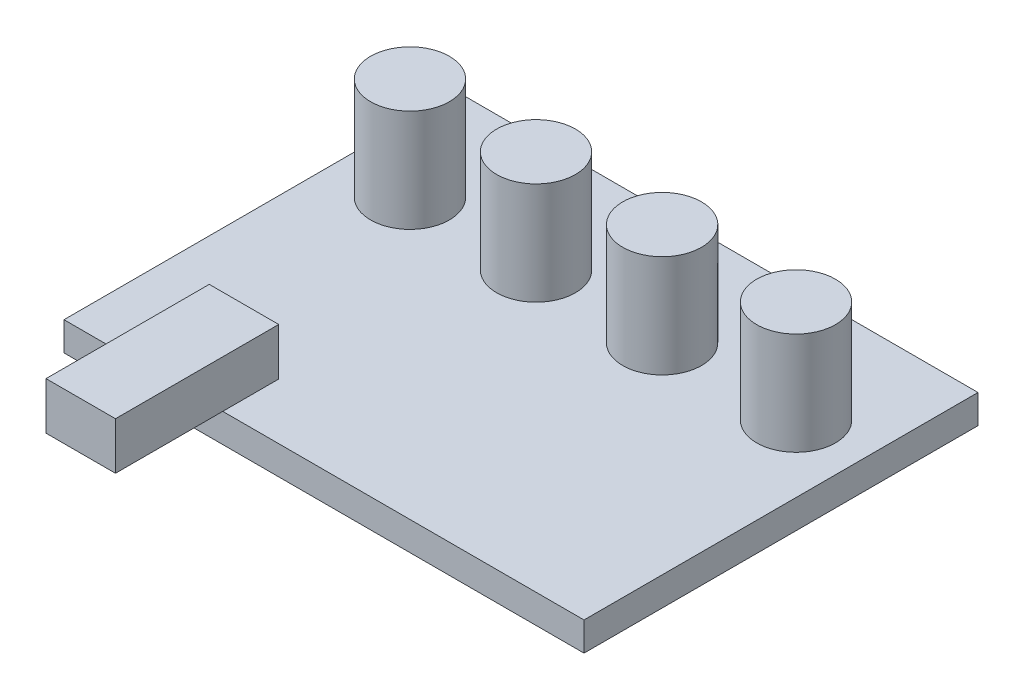
ISO-10303-21;
HEADER;
FILE_DESCRIPTION(('STEP AP214'),'2;1');
FILE_NAME('part.step','',(''),(''),'','','');
FILE_SCHEMA(('AUTOMOTIVE_DESIGN { 1 0 10303 214 1 1 1 1 }'));
ENDSEC;
DATA;
#1=APPLICATION_CONTEXT('core data for automotive mechanical design processes');
#2=APPLICATION_PROTOCOL_DEFINITION('international standard','automotive_design',2000,#1);
#3=PRODUCT_CONTEXT('',#1,'mechanical');
#4=PRODUCT('Part','Part','',(#3));
#5=PRODUCT_RELATED_PRODUCT_CATEGORY('part','',(#4));
#6=PRODUCT_DEFINITION_FORMATION('','',#4);
#7=PRODUCT_DEFINITION_CONTEXT('part definition',#1,'design');
#8=PRODUCT_DEFINITION('design','',#6,#7);
#9=PRODUCT_DEFINITION_SHAPE('','',#8);
#10=(LENGTH_UNIT() NAMED_UNIT(*) SI_UNIT(.MILLI.,.METRE.));
#11=(NAMED_UNIT(*) PLANE_ANGLE_UNIT() SI_UNIT($,.RADIAN.));
#12=(NAMED_UNIT(*) SI_UNIT($,.STERADIAN.) SOLID_ANGLE_UNIT());
#13=UNCERTAINTY_MEASURE_WITH_UNIT(LENGTH_MEASURE(1.E-05),#10,'distance_accuracy_value','');
#14=(GEOMETRIC_REPRESENTATION_CONTEXT(3) GLOBAL_UNCERTAINTY_ASSIGNED_CONTEXT((#13)) GLOBAL_UNIT_ASSIGNED_CONTEXT((#10,
#11,#12)) REPRESENTATION_CONTEXT('',''));
#15=CARTESIAN_POINT('',(0.,0.,0.));
#16=DIRECTION('',(0.,0.,1.));
#17=DIRECTION('',(1.,0.,0.));
#18=AXIS2_PLACEMENT_3D('',#15,#16,#17);
#19=CARTESIAN_POINT('',(0.,3.65,0.));
#20=DIRECTION('',(0.,-1.,0.));
#21=DIRECTION('',(0.,0.,-1.));
#22=AXIS2_PLACEMENT_3D('',#19,#20,#21);
#23=PLANE('',#22);
#24=CARTESIAN_POINT('',(-24.5,3.65,-9.71157326409538));
#25=DIRECTION('',(0.,-1.,0.));
#26=DIRECTION('',(0.,0.,-1.));
#27=AXIS2_PLACEMENT_3D('',#24,#25,#26);
#28=CIRCLE('',#27,5.);
#29=CARTESIAN_POINT('',(-24.5,3.65,-14.7115732640954));
#30=VERTEX_POINT('',#29);
#31=EDGE_CURVE('E193',#30,#30,#28,.F.);
#32=ORIENTED_EDGE('',*,*,#31,.F.);
#33=EDGE_LOOP('',(#32));
#34=FACE_BOUND('',#33,.T.);
#35=CARTESIAN_POINT('',(-8.5,3.65,-9.71157326409538));
#36=DIRECTION('',(0.,-1.,0.));
#37=DIRECTION('',(0.,0.,-1.));
#38=AXIS2_PLACEMENT_3D('',#35,#36,#37);
#39=CIRCLE('',#38,5.);
#40=CARTESIAN_POINT('',(-8.5,3.65,-14.7115732640954));
#41=VERTEX_POINT('',#40);
#42=EDGE_CURVE('E196',#41,#41,#39,.F.);
#43=ORIENTED_EDGE('',*,*,#42,.F.);
#44=EDGE_LOOP('',(#43));
#45=FACE_BOUND('',#44,.T.);
#46=CARTESIAN_POINT('',(7.5,3.65,-9.71157326409538));
#47=DIRECTION('',(0.,-1.,0.));
#48=DIRECTION('',(0.,0.,-1.));
#49=AXIS2_PLACEMENT_3D('',#46,#47,#48);
#50=CIRCLE('',#49,5.);
#51=CARTESIAN_POINT('',(7.5,3.65,-14.7115732640954));
#52=VERTEX_POINT('',#51);
#53=EDGE_CURVE('E199',#52,#52,#50,.F.);
#54=ORIENTED_EDGE('',*,*,#53,.F.);
#55=EDGE_LOOP('',(#54));
#56=FACE_BOUND('',#55,.T.);
#57=CARTESIAN_POINT('',(24.5,3.65,-9.71157326409538));
#58=DIRECTION('',(0.,-1.,0.));
#59=DIRECTION('',(0.,0.,-1.));
#60=AXIS2_PLACEMENT_3D('',#57,#58,#59);
#61=CIRCLE('',#60,5.);
#62=CARTESIAN_POINT('',(24.5,3.65,-14.7115732640954));
#63=VERTEX_POINT('',#62);
#64=EDGE_CURVE('E53',#63,#63,#61,.F.);
#65=ORIENTED_EDGE('',*,*,#64,.F.);
#66=EDGE_LOOP('',(#65));
#67=FACE_BOUND('',#66,.T.);
#68=DIRECTION('',(0.,0.,1.));
#69=VECTOR('',#68,1.);
#70=CARTESIAN_POINT('',(-21.6659753884867,3.65,18.5965502759947));
#71=LINE('',#70,#69);
#72=CARTESIAN_POINT('',(-21.6659753884867,3.65,18.5965502759947));
#73=VERTEX_POINT('',#72);
#74=CARTESIAN_POINT('',(-21.6659753884867,3.65,25.7));
#75=VERTEX_POINT('',#74);
#76=EDGE_CURVE('E210',#73,#75,#71,.T.);
#77=ORIENTED_EDGE('',*,*,#76,.F.);
#78=DIRECTION('',(-1.,0.,0.));
#79=VECTOR('',#78,1.);
#80=CARTESIAN_POINT('',(-21.6659753884867,3.65,18.5965502759947));
#81=LINE('',#80,#79);
#82=CARTESIAN_POINT('',(-12.8496683926261,3.65,18.5965502759947));
#83=VERTEX_POINT('',#82);
#84=EDGE_CURVE('E60',#83,#73,#81,.T.);
#85=ORIENTED_EDGE('',*,*,#84,.F.);
#86=DIRECTION('',(0.,0.,-1.));
#87=VECTOR('',#86,1.);
#88=CARTESIAN_POINT('',(-12.8496683926261,3.65,0.));
#89=LINE('',#88,#87);
#90=CARTESIAN_POINT('',(-12.8496683926261,3.65,25.7));
#91=VERTEX_POINT('',#90);
#92=EDGE_CURVE('E11',#91,#83,#89,.T.);
#93=ORIENTED_EDGE('',*,*,#92,.F.);
#94=DIRECTION('',(1.,0.,0.));
#95=VECTOR('',#94,1.);
#96=CARTESIAN_POINT('',(32.9989133056295,3.65,25.7));
#97=LINE('',#96,#95);
#98=CARTESIAN_POINT('',(32.9989133056295,3.65,25.7));
#99=VERTEX_POINT('',#98);
#100=EDGE_CURVE('E161',#91,#99,#97,.T.);
#101=ORIENTED_EDGE('',*,*,#100,.T.);
#102=DIRECTION('',(0.,0.,-1.));
#103=VECTOR('',#102,1.);
#104=CARTESIAN_POINT('',(32.9989133056295,3.65,-24.3));
#105=LINE('',#104,#103);
#106=CARTESIAN_POINT('',(32.9989133056295,3.65,-24.3));
#107=VERTEX_POINT('',#106);
#108=EDGE_CURVE('E167',#99,#107,#105,.T.);
#109=ORIENTED_EDGE('',*,*,#108,.T.);
#110=DIRECTION('',(-1.,0.,0.));
#111=VECTOR('',#110,1.);
#112=CARTESIAN_POINT('',(-32.9989133056295,3.65,-24.3));
#113=LINE('',#112,#111);
#114=CARTESIAN_POINT('',(-32.9989133056295,3.65,-24.3));
#115=VERTEX_POINT('',#114);
#116=EDGE_CURVE('E171',#107,#115,#113,.T.);
#117=ORIENTED_EDGE('',*,*,#116,.T.);
#118=DIRECTION('',(0.,0.,1.));
#119=VECTOR('',#118,1.);
#120=CARTESIAN_POINT('',(-32.9989133056295,3.65,-24.3));
#121=LINE('',#120,#119);
#122=CARTESIAN_POINT('',(-32.9989133056295,3.65,25.7));
#123=VERTEX_POINT('',#122);
#124=EDGE_CURVE('E157',#115,#123,#121,.T.);
#125=ORIENTED_EDGE('',*,*,#124,.T.);
#126=EDGE_CURVE('E163',#123,#75,#97,.T.);
#127=ORIENTED_EDGE('',*,*,#126,.T.);
#128=EDGE_LOOP('',(#77,#85,#93,#101,#109,#117,#125,#127));
#129=FACE_BOUND('',#128,.T.);
#130=ADVANCED_FACE('F45',(#34,#45,#56,#67,#129),#23,.F.);
#131=CARTESIAN_POINT('',(-32.9989133056295,3.65,-24.3));
#132=DIRECTION('',(1.,0.,0.));
#133=DIRECTION('',(0.,0.,-1.));
#134=AXIS2_PLACEMENT_3D('',#131,#132,#133);
#135=PLANE('',#134);
#136=DIRECTION('',(0.,0.,1.));
#137=VECTOR('',#136,1.);
#138=CARTESIAN_POINT('',(-32.9989133056295,0.,-24.3));
#139=LINE('',#138,#137);
#140=CARTESIAN_POINT('',(-32.9989133056295,0.,-24.3));
#141=VERTEX_POINT('',#140);
#142=CARTESIAN_POINT('',(-32.9989133056295,0.,25.7));
#143=VERTEX_POINT('',#142);
#144=EDGE_CURVE('E156',#141,#143,#139,.T.);
#145=ORIENTED_EDGE('',*,*,#144,.T.);
#146=DIRECTION('',(0.,-1.,0.));
#147=VECTOR('',#146,1.);
#148=CARTESIAN_POINT('',(-32.9989133056295,3.65,25.7));
#149=LINE('',#148,#147);
#150=EDGE_CURVE('E190',#123,#143,#149,.T.);
#151=ORIENTED_EDGE('',*,*,#150,.F.);
#152=ORIENTED_EDGE('',*,*,#124,.F.);
#153=DIRECTION('',(0.,-1.,0.));
#154=VECTOR('',#153,1.);
#155=CARTESIAN_POINT('',(-32.9989133056295,3.65,-24.3));
#156=LINE('',#155,#154);
#157=EDGE_CURVE('E173',#115,#141,#156,.T.);
#158=ORIENTED_EDGE('',*,*,#157,.T.);
#159=EDGE_LOOP('',(#145,#151,#152,#158));
#160=FACE_BOUND('',#159,.T.);
#161=ADVANCED_FACE('F47',(#160),#135,.F.);
#162=CARTESIAN_POINT('',(32.9989133056295,3.65,25.7));
#163=DIRECTION('',(0.,0.,-1.));
#164=DIRECTION('',(-1.,0.,0.));
#165=AXIS2_PLACEMENT_3D('',#162,#163,#164);
#166=PLANE('',#165);
#167=DIRECTION('',(1.,0.,0.));
#168=VECTOR('',#167,1.);
#169=CARTESIAN_POINT('',(32.9989133056295,0.,25.7));
#170=LINE('',#169,#168);
#171=CARTESIAN_POINT('',(32.9989133056295,0.,25.7));
#172=VERTEX_POINT('',#171);
#173=EDGE_CURVE('E176',#143,#172,#170,.T.);
#174=ORIENTED_EDGE('',*,*,#173,.T.);
#175=DIRECTION('',(0.,-1.,0.));
#176=VECTOR('',#175,1.);
#177=CARTESIAN_POINT('',(32.9989133056295,3.65,25.7));
#178=LINE('',#177,#176);
#179=EDGE_CURVE('E187',#99,#172,#178,.T.);
#180=ORIENTED_EDGE('',*,*,#179,.F.);
#181=ORIENTED_EDGE('',*,*,#100,.F.);
#182=EDGE_CURVE('E168',#75,#91,#97,.T.);
#183=ORIENTED_EDGE('',*,*,#182,.F.);
#184=ORIENTED_EDGE('',*,*,#126,.F.);
#185=ORIENTED_EDGE('',*,*,#150,.T.);
#186=EDGE_LOOP('',(#174,#180,#181,#183,#184,#185));
#187=FACE_BOUND('',#186,.T.);
#188=ADVANCED_FACE('F236',(#187),#166,.F.);
#189=CARTESIAN_POINT('',(32.9989133056295,3.65,-24.3));
#190=DIRECTION('',(-1.,0.,0.));
#191=DIRECTION('',(0.,0.,1.));
#192=AXIS2_PLACEMENT_3D('',#189,#190,#191);
#193=PLANE('',#192);
#194=DIRECTION('',(0.,0.,-1.));
#195=VECTOR('',#194,1.);
#196=CARTESIAN_POINT('',(32.9989133056295,0.,-24.3));
#197=LINE('',#196,#195);
#198=CARTESIAN_POINT('',(32.9989133056295,0.,-24.3));
#199=VERTEX_POINT('',#198);
#200=EDGE_CURVE('E178',#172,#199,#197,.T.);
#201=ORIENTED_EDGE('',*,*,#200,.T.);
#202=DIRECTION('',(0.,-1.,0.));
#203=VECTOR('',#202,1.);
#204=CARTESIAN_POINT('',(32.9989133056295,3.65,-24.3));
#205=LINE('',#204,#203);
#206=EDGE_CURVE('E184',#107,#199,#205,.T.);
#207=ORIENTED_EDGE('',*,*,#206,.F.);
#208=ORIENTED_EDGE('',*,*,#108,.F.);
#209=ORIENTED_EDGE('',*,*,#179,.T.);
#210=EDGE_LOOP('',(#201,#207,#208,#209));
#211=FACE_BOUND('',#210,.T.);
#212=ADVANCED_FACE('F239',(#211),#193,.F.);
#213=CARTESIAN_POINT('',(-32.9989133056295,3.65,-24.3));
#214=DIRECTION('',(0.,0.,1.));
#215=DIRECTION('',(1.,0.,0.));
#216=AXIS2_PLACEMENT_3D('',#213,#214,#215);
#217=PLANE('',#216);
#218=DIRECTION('',(-1.,0.,0.));
#219=VECTOR('',#218,1.);
#220=CARTESIAN_POINT('',(-32.9989133056295,0.,-24.3));
#221=LINE('',#220,#219);
#222=EDGE_CURVE('E162',#199,#141,#221,.T.);
#223=ORIENTED_EDGE('',*,*,#222,.T.);
#224=ORIENTED_EDGE('',*,*,#157,.F.);
#225=ORIENTED_EDGE('',*,*,#116,.F.);
#226=ORIENTED_EDGE('',*,*,#206,.T.);
#227=EDGE_LOOP('',(#223,#224,#225,#226));
#228=FACE_BOUND('',#227,.T.);
#229=ADVANCED_FACE('F244',(#228),#217,.F.);
#230=CARTESIAN_POINT('',(0.,0.,0.));
#231=DIRECTION('',(0.,-1.,0.));
#232=DIRECTION('',(0.,0.,-1.));
#233=AXIS2_PLACEMENT_3D('',#230,#231,#232);
#234=PLANE('',#233);
#235=ORIENTED_EDGE('',*,*,#144,.F.);
#236=ORIENTED_EDGE('',*,*,#222,.F.);
#237=ORIENTED_EDGE('',*,*,#200,.F.);
#238=ORIENTED_EDGE('',*,*,#173,.F.);
#239=EDGE_LOOP('',(#235,#236,#237,#238));
#240=FACE_BOUND('',#239,.T.);
#241=ADVANCED_FACE('F250',(#240),#234,.T.);
#242=CARTESIAN_POINT('',(-24.5,16.65,-9.71157326409538));
#243=DIRECTION('',(0.,-1.,0.));
#244=DIRECTION('',(0.,0.,-1.));
#245=AXIS2_PLACEMENT_3D('',#242,#243,#244);
#246=CYLINDRICAL_SURFACE('',#245,5.);
#247=CARTESIAN_POINT('',(-24.5,16.65,-9.71157326409538));
#248=DIRECTION('',(0.,1.,0.));
#249=DIRECTION('',(0.,0.,1.));
#250=AXIS2_PLACEMENT_3D('',#247,#248,#249);
#251=CIRCLE('',#250,5.);
#252=CARTESIAN_POINT('',(-24.5,16.65,-14.7115732640954));
#253=VERTEX_POINT('',#252);
#254=EDGE_CURVE('E153',#253,#253,#251,.T.);
#255=CARTESIAN_POINT('',(-24.5,16.65,-14.7115732640954));
#256=CARTESIAN_POINT('',(-24.5,16.5145833333333,-14.7115732640954));
#257=CARTESIAN_POINT('',(-24.5,16.3791666666667,-14.7115732640954));
#258=CARTESIAN_POINT('',(-24.5,16.1083333333333,-14.7115732640954));
#259=CARTESIAN_POINT('',(-24.5,15.9729166666667,-14.7115732640954));
#260=CARTESIAN_POINT('',(-24.5,15.7020833333333,-14.7115732640954));
#261=CARTESIAN_POINT('',(-24.5,15.5666666666667,-14.7115732640954));
#262=CARTESIAN_POINT('',(-24.5,15.2958333333333,-14.7115732640954));
#263=CARTESIAN_POINT('',(-24.5,15.1604166666667,-14.7115732640954));
#264=CARTESIAN_POINT('',(-24.5,14.8895833333333,-14.7115732640954));
#265=CARTESIAN_POINT('',(-24.5,14.7541666666667,-14.7115732640954));
#266=CARTESIAN_POINT('',(-24.5,14.4833333333333,-14.7115732640954));
#267=CARTESIAN_POINT('',(-24.5,14.3479166666667,-14.7115732640954));
#268=CARTESIAN_POINT('',(-24.5,14.0770833333333,-14.7115732640954));
#269=CARTESIAN_POINT('',(-24.5,13.9416666666667,-14.7115732640954));
#270=CARTESIAN_POINT('',(-24.5,13.6708333333333,-14.7115732640954));
#271=CARTESIAN_POINT('',(-24.5,13.5354166666667,-14.7115732640954));
#272=CARTESIAN_POINT('',(-24.5,13.2645833333333,-14.7115732640954));
#273=CARTESIAN_POINT('',(-24.5,13.1291666666667,-14.7115732640954));
#274=CARTESIAN_POINT('',(-24.5,12.8583333333333,-14.7115732640954));
#275=CARTESIAN_POINT('',(-24.5,12.7229166666667,-14.7115732640954));
#276=CARTESIAN_POINT('',(-24.5,12.4520833333333,-14.7115732640954));
#277=CARTESIAN_POINT('',(-24.5,12.3166666666667,-14.7115732640954));
#278=CARTESIAN_POINT('',(-24.5,12.0458333333333,-14.7115732640954));
#279=CARTESIAN_POINT('',(-24.5,11.9104166666667,-14.7115732640954));
#280=CARTESIAN_POINT('',(-24.5,11.6395833333333,-14.7115732640954));
#281=CARTESIAN_POINT('',(-24.5,11.5041666666667,-14.7115732640954));
#282=CARTESIAN_POINT('',(-24.5,11.2333333333333,-14.7115732640954));
#283=CARTESIAN_POINT('',(-24.5,11.0979166666667,-14.7115732640954));
#284=CARTESIAN_POINT('',(-24.5,10.8270833333333,-14.7115732640954));
#285=CARTESIAN_POINT('',(-24.5,10.6916666666667,-14.7115732640954));
#286=CARTESIAN_POINT('',(-24.5,10.4208333333333,-14.7115732640954));
#287=CARTESIAN_POINT('',(-24.5,10.2854166666667,-14.7115732640954));
#288=CARTESIAN_POINT('',(-24.5,10.0145833333333,-14.7115732640954));
#289=CARTESIAN_POINT('',(-24.5,9.87916666666667,-14.7115732640954));
#290=CARTESIAN_POINT('',(-24.5,9.60833333333333,-14.7115732640954));
#291=CARTESIAN_POINT('',(-24.5,9.47291666666667,-14.7115732640954));
#292=CARTESIAN_POINT('',(-24.5,9.20208333333333,-14.7115732640954));
#293=CARTESIAN_POINT('',(-24.5,9.06666666666667,-14.7115732640954));
#294=CARTESIAN_POINT('',(-24.5,8.79583333333333,-14.7115732640954));
#295=CARTESIAN_POINT('',(-24.5,8.66041666666667,-14.7115732640954));
#296=CARTESIAN_POINT('',(-24.5,8.38958333333333,-14.7115732640954));
#297=CARTESIAN_POINT('',(-24.5,8.25416666666667,-14.7115732640954));
#298=CARTESIAN_POINT('',(-24.5,7.98333333333333,-14.7115732640954));
#299=CARTESIAN_POINT('',(-24.5,7.84791666666667,-14.7115732640954));
#300=CARTESIAN_POINT('',(-24.5,7.57708333333333,-14.7115732640954));
#301=CARTESIAN_POINT('',(-24.5,7.44166666666667,-14.7115732640954));
#302=CARTESIAN_POINT('',(-24.5,7.17083333333333,-14.7115732640954));
#303=CARTESIAN_POINT('',(-24.5,7.03541666666667,-14.7115732640954));
#304=CARTESIAN_POINT('',(-24.5,6.76458333333334,-14.7115732640954));
#305=CARTESIAN_POINT('',(-24.5,6.62916666666667,-14.7115732640954));
#306=CARTESIAN_POINT('',(-24.5,6.35833333333334,-14.7115732640954));
#307=CARTESIAN_POINT('',(-24.5,6.22291666666667,-14.7115732640954));
#308=CARTESIAN_POINT('',(-24.5,5.95208333333333,-14.7115732640954));
#309=CARTESIAN_POINT('',(-24.5,5.81666666666667,-14.7115732640954));
#310=CARTESIAN_POINT('',(-24.5,5.54583333333334,-14.7115732640954));
#311=CARTESIAN_POINT('',(-24.5,5.41041666666667,-14.7115732640954));
#312=CARTESIAN_POINT('',(-24.5,5.13958333333334,-14.7115732640954));
#313=CARTESIAN_POINT('',(-24.5,5.00416666666667,-14.7115732640954));
#314=CARTESIAN_POINT('',(-24.5,4.73333333333334,-14.7115732640954));
#315=CARTESIAN_POINT('',(-24.5,4.59791666666667,-14.7115732640954));
#316=CARTESIAN_POINT('',(-24.5,4.32708333333333,-14.7115732640954));
#317=CARTESIAN_POINT('',(-24.5,4.19166666666667,-14.7115732640954));
#318=CARTESIAN_POINT('',(-24.5,3.92083333333334,-14.7115732640954));
#319=CARTESIAN_POINT('',(-24.5,3.78541666666667,-14.7115732640954));
#320=CARTESIAN_POINT('',(-24.5,3.65,-14.7115732640954));
#321=B_SPLINE_CURVE_WITH_KNOTS('',3,(#255,#256,#257,#258,#259,#260,#261,#262,#263,#264,#265,
#266,#267,#268,#269,#270,#271,#272,#273,#274,#275,#276,#277,#278,#279,#280,#281,#282,#283,#284,
#285,#286,#287,#288,#289,#290,#291,#292,#293,#294,#295,#296,#297,#298,#299,#300,#301,#302,#303,
#304,#305,#306,#307,#308,#309,#310,#311,#312,#313,#314,#315,#316,#317,#318,#319,#320),
.UNSPECIFIED.,.F.,.F.,(4,2,2,2,2,2,2,2,2,2,2,2,2,2,2,2,2,2,2,2,2,2,2,2,2,2,2,2,2,2,2,2,4),(0.,
0.40625,0.812500000000001,1.21875,1.625,2.03125,2.4375,2.84375,3.25,3.65625,4.0625,4.46875,
4.875,5.28125,5.6875,6.09375,6.5,6.90625,7.3125,7.71875,8.125,8.53125,8.9375,9.34375,9.75,
10.15625,10.5625,10.96875,11.375,11.78125,12.1875,12.59375,13.),.UNSPECIFIED.);
#322=EDGE_CURVE('BSEAM252',#253,#30,#321,.T.);
#323=ORIENTED_EDGE('',*,*,#254,.F.);
#324=ORIENTED_EDGE('',*,*,#31,.T.);
#325=ORIENTED_EDGE('',*,*,#322,.T.);
#326=ORIENTED_EDGE('',*,*,#322,.F.);
#327=EDGE_LOOP('',(#323,#325,#324,#326));
#328=FACE_BOUND('',#327,.T.);
#329=ADVANCED_FACE('F252',(#328),#246,.T.);
#330=CARTESIAN_POINT('',(-24.5,16.65,-9.71157326409538));
#331=DIRECTION('',(0.,1.,0.));
#332=DIRECTION('',(0.,0.,1.));
#333=AXIS2_PLACEMENT_3D('',#330,#331,#332);
#334=PLANE('',#333);
#335=ORIENTED_EDGE('',*,*,#254,.T.);
#336=EDGE_LOOP('',(#335));
#337=FACE_BOUND('',#336,.T.);
#338=ADVANCED_FACE('F257',(#337),#334,.T.);
#339=CARTESIAN_POINT('',(-8.5,16.65,-9.71157326409538));
#340=DIRECTION('',(0.,-1.,0.));
#341=DIRECTION('',(0.,0.,-1.));
#342=AXIS2_PLACEMENT_3D('',#339,#340,#341);
#343=CYLINDRICAL_SURFACE('',#342,5.);
#344=CARTESIAN_POINT('',(-8.5,16.65,-9.71157326409538));
#345=DIRECTION('',(0.,1.,0.));
#346=DIRECTION('',(0.,0.,1.));
#347=AXIS2_PLACEMENT_3D('',#344,#345,#346);
#348=CIRCLE('',#347,5.);
#349=CARTESIAN_POINT('',(-8.5,16.65,-14.7115732640954));
#350=VERTEX_POINT('',#349);
#351=EDGE_CURVE('E150',#350,#350,#348,.T.);
#352=CARTESIAN_POINT('',(-8.5,16.65,-14.7115732640954));
#353=CARTESIAN_POINT('',(-8.5,16.5145833333333,-14.7115732640954));
#354=CARTESIAN_POINT('',(-8.5,16.3791666666667,-14.7115732640954));
#355=CARTESIAN_POINT('',(-8.5,16.1083333333333,-14.7115732640954));
#356=CARTESIAN_POINT('',(-8.5,15.9729166666667,-14.7115732640954));
#357=CARTESIAN_POINT('',(-8.5,15.7020833333333,-14.7115732640954));
#358=CARTESIAN_POINT('',(-8.5,15.5666666666667,-14.7115732640954));
#359=CARTESIAN_POINT('',(-8.5,15.2958333333333,-14.7115732640954));
#360=CARTESIAN_POINT('',(-8.5,15.1604166666667,-14.7115732640954));
#361=CARTESIAN_POINT('',(-8.5,14.8895833333333,-14.7115732640954));
#362=CARTESIAN_POINT('',(-8.5,14.7541666666667,-14.7115732640954));
#363=CARTESIAN_POINT('',(-8.5,14.4833333333333,-14.7115732640954));
#364=CARTESIAN_POINT('',(-8.5,14.3479166666667,-14.7115732640954));
#365=CARTESIAN_POINT('',(-8.5,14.0770833333333,-14.7115732640954));
#366=CARTESIAN_POINT('',(-8.5,13.9416666666667,-14.7115732640954));
#367=CARTESIAN_POINT('',(-8.5,13.6708333333333,-14.7115732640954));
#368=CARTESIAN_POINT('',(-8.5,13.5354166666667,-14.7115732640954));
#369=CARTESIAN_POINT('',(-8.5,13.2645833333333,-14.7115732640954));
#370=CARTESIAN_POINT('',(-8.5,13.1291666666667,-14.7115732640954));
#371=CARTESIAN_POINT('',(-8.5,12.8583333333333,-14.7115732640954));
#372=CARTESIAN_POINT('',(-8.5,12.7229166666667,-14.7115732640954));
#373=CARTESIAN_POINT('',(-8.5,12.4520833333333,-14.7115732640954));
#374=CARTESIAN_POINT('',(-8.5,12.3166666666667,-14.7115732640954));
#375=CARTESIAN_POINT('',(-8.5,12.0458333333333,-14.7115732640954));
#376=CARTESIAN_POINT('',(-8.5,11.9104166666667,-14.7115732640954));
#377=CARTESIAN_POINT('',(-8.5,11.6395833333333,-14.7115732640954));
#378=CARTESIAN_POINT('',(-8.5,11.5041666666667,-14.7115732640954));
#379=CARTESIAN_POINT('',(-8.5,11.2333333333333,-14.7115732640954));
#380=CARTESIAN_POINT('',(-8.5,11.0979166666667,-14.7115732640954));
#381=CARTESIAN_POINT('',(-8.5,10.8270833333333,-14.7115732640954));
#382=CARTESIAN_POINT('',(-8.5,10.6916666666667,-14.7115732640954));
#383=CARTESIAN_POINT('',(-8.5,10.4208333333333,-14.7115732640954));
#384=CARTESIAN_POINT('',(-8.5,10.2854166666667,-14.7115732640954));
#385=CARTESIAN_POINT('',(-8.5,10.0145833333333,-14.7115732640954));
#386=CARTESIAN_POINT('',(-8.5,9.87916666666667,-14.7115732640954));
#387=CARTESIAN_POINT('',(-8.5,9.60833333333333,-14.7115732640954));
#388=CARTESIAN_POINT('',(-8.5,9.47291666666667,-14.7115732640954));
#389=CARTESIAN_POINT('',(-8.5,9.20208333333333,-14.7115732640954));
#390=CARTESIAN_POINT('',(-8.5,9.06666666666667,-14.7115732640954));
#391=CARTESIAN_POINT('',(-8.5,8.79583333333333,-14.7115732640954));
#392=CARTESIAN_POINT('',(-8.5,8.66041666666667,-14.7115732640954));
#393=CARTESIAN_POINT('',(-8.5,8.38958333333333,-14.7115732640954));
#394=CARTESIAN_POINT('',(-8.5,8.25416666666667,-14.7115732640954));
#395=CARTESIAN_POINT('',(-8.5,7.98333333333333,-14.7115732640954));
#396=CARTESIAN_POINT('',(-8.5,7.84791666666667,-14.7115732640954));
#397=CARTESIAN_POINT('',(-8.5,7.57708333333333,-14.7115732640954));
#398=CARTESIAN_POINT('',(-8.5,7.44166666666667,-14.7115732640954));
#399=CARTESIAN_POINT('',(-8.5,7.17083333333333,-14.7115732640954));
#400=CARTESIAN_POINT('',(-8.5,7.03541666666667,-14.7115732640954));
#401=CARTESIAN_POINT('',(-8.5,6.76458333333334,-14.7115732640954));
#402=CARTESIAN_POINT('',(-8.5,6.62916666666667,-14.7115732640954));
#403=CARTESIAN_POINT('',(-8.5,6.35833333333334,-14.7115732640954));
#404=CARTESIAN_POINT('',(-8.5,6.22291666666667,-14.7115732640954));
#405=CARTESIAN_POINT('',(-8.5,5.95208333333333,-14.7115732640954));
#406=CARTESIAN_POINT('',(-8.5,5.81666666666667,-14.7115732640954));
#407=CARTESIAN_POINT('',(-8.5,5.54583333333334,-14.7115732640954));
#408=CARTESIAN_POINT('',(-8.5,5.41041666666667,-14.7115732640954));
#409=CARTESIAN_POINT('',(-8.5,5.13958333333334,-14.7115732640954));
#410=CARTESIAN_POINT('',(-8.5,5.00416666666667,-14.7115732640954));
#411=CARTESIAN_POINT('',(-8.5,4.73333333333334,-14.7115732640954));
#412=CARTESIAN_POINT('',(-8.5,4.59791666666667,-14.7115732640954));
#413=CARTESIAN_POINT('',(-8.5,4.32708333333333,-14.7115732640954));
#414=CARTESIAN_POINT('',(-8.5,4.19166666666667,-14.7115732640954));
#415=CARTESIAN_POINT('',(-8.5,3.92083333333334,-14.7115732640954));
#416=CARTESIAN_POINT('',(-8.5,3.78541666666667,-14.7115732640954));
#417=CARTESIAN_POINT('',(-8.5,3.65,-14.7115732640954));
#418=B_SPLINE_CURVE_WITH_KNOTS('',3,(#352,#353,#354,#355,#356,#357,#358,#359,#360,#361,#362,
#363,#364,#365,#366,#367,#368,#369,#370,#371,#372,#373,#374,#375,#376,#377,#378,#379,#380,#381,
#382,#383,#384,#385,#386,#387,#388,#389,#390,#391,#392,#393,#394,#395,#396,#397,#398,#399,#400,
#401,#402,#403,#404,#405,#406,#407,#408,#409,#410,#411,#412,#413,#414,#415,#416,#417),
.UNSPECIFIED.,.F.,.F.,(4,2,2,2,2,2,2,2,2,2,2,2,2,2,2,2,2,2,2,2,2,2,2,2,2,2,2,2,2,2,2,2,4),(0.,
0.40625,0.812500000000001,1.21875,1.625,2.03125,2.4375,2.84375,3.25,3.65625,4.0625,4.46875,
4.875,5.28125,5.6875,6.09375,6.5,6.90625,7.3125,7.71875,8.125,8.53125,8.9375,9.34375,9.75,
10.15625,10.5625,10.96875,11.375,11.78125,12.1875,12.59375,13.),.UNSPECIFIED.);
#419=EDGE_CURVE('BSEAM286',#350,#41,#418,.T.);
#420=ORIENTED_EDGE('',*,*,#351,.F.);
#421=ORIENTED_EDGE('',*,*,#42,.T.);
#422=ORIENTED_EDGE('',*,*,#419,.T.);
#423=ORIENTED_EDGE('',*,*,#419,.F.);
#424=EDGE_LOOP('',(#420,#422,#421,#423));
#425=FACE_BOUND('',#424,.T.);
#426=ADVANCED_FACE('F286',(#425),#343,.T.);
#427=CARTESIAN_POINT('',(-8.5,16.65,-9.71157326409538));
#428=DIRECTION('',(0.,1.,0.));
#429=DIRECTION('',(0.,0.,1.));
#430=AXIS2_PLACEMENT_3D('',#427,#428,#429);
#431=PLANE('',#430);
#432=ORIENTED_EDGE('',*,*,#351,.T.);
#433=EDGE_LOOP('',(#432));
#434=FACE_BOUND('',#433,.T.);
#435=ADVANCED_FACE('F279',(#434),#431,.T.);
#436=CARTESIAN_POINT('',(7.5,16.65,-9.71157326409538));
#437=DIRECTION('',(0.,-1.,0.));
#438=DIRECTION('',(0.,0.,-1.));
#439=AXIS2_PLACEMENT_3D('',#436,#437,#438);
#440=CYLINDRICAL_SURFACE('',#439,5.);
#441=CARTESIAN_POINT('',(7.5,16.65,-9.71157326409538));
#442=DIRECTION('',(0.,1.,0.));
#443=DIRECTION('',(0.,0.,1.));
#444=AXIS2_PLACEMENT_3D('',#441,#442,#443);
#445=CIRCLE('',#444,5.);
#446=CARTESIAN_POINT('',(7.5,16.65,-14.7115732640954));
#447=VERTEX_POINT('',#446);
#448=EDGE_CURVE('E141',#447,#447,#445,.T.);
#449=CARTESIAN_POINT('',(7.5,16.65,-14.7115732640954));
#450=CARTESIAN_POINT('',(7.5,16.5145833333333,-14.7115732640954));
#451=CARTESIAN_POINT('',(7.5,16.3791666666667,-14.7115732640954));
#452=CARTESIAN_POINT('',(7.5,16.1083333333333,-14.7115732640954));
#453=CARTESIAN_POINT('',(7.5,15.9729166666667,-14.7115732640954));
#454=CARTESIAN_POINT('',(7.5,15.7020833333333,-14.7115732640954));
#455=CARTESIAN_POINT('',(7.5,15.5666666666667,-14.7115732640954));
#456=CARTESIAN_POINT('',(7.5,15.2958333333333,-14.7115732640954));
#457=CARTESIAN_POINT('',(7.5,15.1604166666667,-14.7115732640954));
#458=CARTESIAN_POINT('',(7.5,14.8895833333333,-14.7115732640954));
#459=CARTESIAN_POINT('',(7.5,14.7541666666667,-14.7115732640954));
#460=CARTESIAN_POINT('',(7.5,14.4833333333333,-14.7115732640954));
#461=CARTESIAN_POINT('',(7.5,14.3479166666667,-14.7115732640954));
#462=CARTESIAN_POINT('',(7.5,14.0770833333333,-14.7115732640954));
#463=CARTESIAN_POINT('',(7.5,13.9416666666667,-14.7115732640954));
#464=CARTESIAN_POINT('',(7.5,13.6708333333333,-14.7115732640954));
#465=CARTESIAN_POINT('',(7.5,13.5354166666667,-14.7115732640954));
#466=CARTESIAN_POINT('',(7.5,13.2645833333333,-14.7115732640954));
#467=CARTESIAN_POINT('',(7.5,13.1291666666667,-14.7115732640954));
#468=CARTESIAN_POINT('',(7.5,12.8583333333333,-14.7115732640954));
#469=CARTESIAN_POINT('',(7.5,12.7229166666667,-14.7115732640954));
#470=CARTESIAN_POINT('',(7.5,12.4520833333333,-14.7115732640954));
#471=CARTESIAN_POINT('',(7.5,12.3166666666667,-14.7115732640954));
#472=CARTESIAN_POINT('',(7.5,12.0458333333333,-14.7115732640954));
#473=CARTESIAN_POINT('',(7.5,11.9104166666667,-14.7115732640954));
#474=CARTESIAN_POINT('',(7.5,11.6395833333333,-14.7115732640954));
#475=CARTESIAN_POINT('',(7.5,11.5041666666667,-14.7115732640954));
#476=CARTESIAN_POINT('',(7.5,11.2333333333333,-14.7115732640954));
#477=CARTESIAN_POINT('',(7.5,11.0979166666667,-14.7115732640954));
#478=CARTESIAN_POINT('',(7.5,10.8270833333333,-14.7115732640954));
#479=CARTESIAN_POINT('',(7.5,10.6916666666667,-14.7115732640954));
#480=CARTESIAN_POINT('',(7.5,10.4208333333333,-14.7115732640954));
#481=CARTESIAN_POINT('',(7.5,10.2854166666667,-14.7115732640954));
#482=CARTESIAN_POINT('',(7.5,10.0145833333333,-14.7115732640954));
#483=CARTESIAN_POINT('',(7.5,9.87916666666667,-14.7115732640954));
#484=CARTESIAN_POINT('',(7.5,9.60833333333333,-14.7115732640954));
#485=CARTESIAN_POINT('',(7.5,9.47291666666667,-14.7115732640954));
#486=CARTESIAN_POINT('',(7.5,9.20208333333333,-14.7115732640954));
#487=CARTESIAN_POINT('',(7.5,9.06666666666667,-14.7115732640954));
#488=CARTESIAN_POINT('',(7.5,8.79583333333333,-14.7115732640954));
#489=CARTESIAN_POINT('',(7.5,8.66041666666667,-14.7115732640954));
#490=CARTESIAN_POINT('',(7.5,8.38958333333333,-14.7115732640954));
#491=CARTESIAN_POINT('',(7.5,8.25416666666667,-14.7115732640954));
#492=CARTESIAN_POINT('',(7.5,7.98333333333333,-14.7115732640954));
#493=CARTESIAN_POINT('',(7.5,7.84791666666667,-14.7115732640954));
#494=CARTESIAN_POINT('',(7.5,7.57708333333333,-14.7115732640954));
#495=CARTESIAN_POINT('',(7.5,7.44166666666667,-14.7115732640954));
#496=CARTESIAN_POINT('',(7.5,7.17083333333333,-14.7115732640954));
#497=CARTESIAN_POINT('',(7.5,7.03541666666667,-14.7115732640954));
#498=CARTESIAN_POINT('',(7.5,6.76458333333334,-14.7115732640954));
#499=CARTESIAN_POINT('',(7.5,6.62916666666667,-14.7115732640954));
#500=CARTESIAN_POINT('',(7.5,6.35833333333334,-14.7115732640954));
#501=CARTESIAN_POINT('',(7.5,6.22291666666667,-14.7115732640954));
#502=CARTESIAN_POINT('',(7.5,5.95208333333333,-14.7115732640954));
#503=CARTESIAN_POINT('',(7.5,5.81666666666667,-14.7115732640954));
#504=CARTESIAN_POINT('',(7.5,5.54583333333334,-14.7115732640954));
#505=CARTESIAN_POINT('',(7.5,5.41041666666667,-14.7115732640954));
#506=CARTESIAN_POINT('',(7.5,5.13958333333334,-14.7115732640954));
#507=CARTESIAN_POINT('',(7.5,5.00416666666667,-14.7115732640954));
#508=CARTESIAN_POINT('',(7.5,4.73333333333334,-14.7115732640954));
#509=CARTESIAN_POINT('',(7.5,4.59791666666667,-14.7115732640954));
#510=CARTESIAN_POINT('',(7.5,4.32708333333333,-14.7115732640954));
#511=CARTESIAN_POINT('',(7.5,4.19166666666667,-14.7115732640954));
#512=CARTESIAN_POINT('',(7.5,3.92083333333334,-14.7115732640954));
#513=CARTESIAN_POINT('',(7.5,3.78541666666667,-14.7115732640954));
#514=CARTESIAN_POINT('',(7.5,3.65,-14.7115732640954));
#515=B_SPLINE_CURVE_WITH_KNOTS('',3,(#449,#450,#451,#452,#453,#454,#455,#456,#457,#458,#459,
#460,#461,#462,#463,#464,#465,#466,#467,#468,#469,#470,#471,#472,#473,#474,#475,#476,#477,#478,
#479,#480,#481,#482,#483,#484,#485,#486,#487,#488,#489,#490,#491,#492,#493,#494,#495,#496,#497,
#498,#499,#500,#501,#502,#503,#504,#505,#506,#507,#508,#509,#510,#511,#512,#513,#514),
.UNSPECIFIED.,.F.,.F.,(4,2,2,2,2,2,2,2,2,2,2,2,2,2,2,2,2,2,2,2,2,2,2,2,2,2,2,2,2,2,2,2,4),(0.,
0.40625,0.812500000000001,1.21875,1.625,2.03125,2.4375,2.84375,3.25,3.65625,4.0625,4.46875,
4.875,5.28125,5.6875,6.09375,6.5,6.90625,7.3125,7.71875,8.125,8.53125,8.9375,9.34375,9.75,
10.15625,10.5625,10.96875,11.375,11.78125,12.1875,12.59375,13.),.UNSPECIFIED.);
#516=EDGE_CURVE('BSEAM273',#447,#52,#515,.T.);
#517=ORIENTED_EDGE('',*,*,#448,.F.);
#518=ORIENTED_EDGE('',*,*,#53,.T.);
#519=ORIENTED_EDGE('',*,*,#516,.T.);
#520=ORIENTED_EDGE('',*,*,#516,.F.);
#521=EDGE_LOOP('',(#517,#519,#518,#520));
#522=FACE_BOUND('',#521,.T.);
#523=ADVANCED_FACE('F273',(#522),#440,.T.);
#524=CARTESIAN_POINT('',(7.5,16.65,-9.71157326409538));
#525=DIRECTION('',(0.,1.,0.));
#526=DIRECTION('',(0.,0.,1.));
#527=AXIS2_PLACEMENT_3D('',#524,#525,#526);
#528=PLANE('',#527);
#529=ORIENTED_EDGE('',*,*,#448,.T.);
#530=EDGE_LOOP('',(#529));
#531=FACE_BOUND('',#530,.T.);
#532=ADVANCED_FACE('F278',(#531),#528,.T.);
#533=CARTESIAN_POINT('',(24.5,16.65,-9.71157326409538));
#534=DIRECTION('',(0.,-1.,0.));
#535=DIRECTION('',(0.,0.,-1.));
#536=AXIS2_PLACEMENT_3D('',#533,#534,#535);
#537=CYLINDRICAL_SURFACE('',#536,5.);
#538=CARTESIAN_POINT('',(24.5,16.65,-9.71157326409538));
#539=DIRECTION('',(0.,1.,0.));
#540=DIRECTION('',(0.,0.,1.));
#541=AXIS2_PLACEMENT_3D('',#538,#539,#540);
#542=CIRCLE('',#541,5.);
#543=CARTESIAN_POINT('',(24.5,16.65,-14.7115732640954));
#544=VERTEX_POINT('',#543);
#545=EDGE_CURVE('E138',#544,#544,#542,.T.);
#546=CARTESIAN_POINT('',(24.5,16.65,-14.7115732640954));
#547=CARTESIAN_POINT('',(24.5,16.5145833333333,-14.7115732640954));
#548=CARTESIAN_POINT('',(24.5,16.3791666666667,-14.7115732640954));
#549=CARTESIAN_POINT('',(24.5,16.1083333333333,-14.7115732640954));
#550=CARTESIAN_POINT('',(24.5,15.9729166666667,-14.7115732640954));
#551=CARTESIAN_POINT('',(24.5,15.7020833333333,-14.7115732640954));
#552=CARTESIAN_POINT('',(24.5,15.5666666666667,-14.7115732640954));
#553=CARTESIAN_POINT('',(24.5,15.2958333333333,-14.7115732640954));
#554=CARTESIAN_POINT('',(24.5,15.1604166666667,-14.7115732640954));
#555=CARTESIAN_POINT('',(24.5,14.8895833333333,-14.7115732640954));
#556=CARTESIAN_POINT('',(24.5,14.7541666666667,-14.7115732640954));
#557=CARTESIAN_POINT('',(24.5,14.4833333333333,-14.7115732640954));
#558=CARTESIAN_POINT('',(24.5,14.3479166666667,-14.7115732640954));
#559=CARTESIAN_POINT('',(24.5,14.0770833333333,-14.7115732640954));
#560=CARTESIAN_POINT('',(24.5,13.9416666666667,-14.7115732640954));
#561=CARTESIAN_POINT('',(24.5,13.6708333333333,-14.7115732640954));
#562=CARTESIAN_POINT('',(24.5,13.5354166666667,-14.7115732640954));
#563=CARTESIAN_POINT('',(24.5,13.2645833333333,-14.7115732640954));
#564=CARTESIAN_POINT('',(24.5,13.1291666666667,-14.7115732640954));
#565=CARTESIAN_POINT('',(24.5,12.8583333333333,-14.7115732640954));
#566=CARTESIAN_POINT('',(24.5,12.7229166666667,-14.7115732640954));
#567=CARTESIAN_POINT('',(24.5,12.4520833333333,-14.7115732640954));
#568=CARTESIAN_POINT('',(24.5,12.3166666666667,-14.7115732640954));
#569=CARTESIAN_POINT('',(24.5,12.0458333333333,-14.7115732640954));
#570=CARTESIAN_POINT('',(24.5,11.9104166666667,-14.7115732640954));
#571=CARTESIAN_POINT('',(24.5,11.6395833333333,-14.7115732640954));
#572=CARTESIAN_POINT('',(24.5,11.5041666666667,-14.7115732640954));
#573=CARTESIAN_POINT('',(24.5,11.2333333333333,-14.7115732640954));
#574=CARTESIAN_POINT('',(24.5,11.0979166666667,-14.7115732640954));
#575=CARTESIAN_POINT('',(24.5,10.8270833333333,-14.7115732640954));
#576=CARTESIAN_POINT('',(24.5,10.6916666666667,-14.7115732640954));
#577=CARTESIAN_POINT('',(24.5,10.4208333333333,-14.7115732640954));
#578=CARTESIAN_POINT('',(24.5,10.2854166666667,-14.7115732640954));
#579=CARTESIAN_POINT('',(24.5,10.0145833333333,-14.7115732640954));
#580=CARTESIAN_POINT('',(24.5,9.87916666666667,-14.7115732640954));
#581=CARTESIAN_POINT('',(24.5,9.60833333333333,-14.7115732640954));
#582=CARTESIAN_POINT('',(24.5,9.47291666666667,-14.7115732640954));
#583=CARTESIAN_POINT('',(24.5,9.20208333333333,-14.7115732640954));
#584=CARTESIAN_POINT('',(24.5,9.06666666666667,-14.7115732640954));
#585=CARTESIAN_POINT('',(24.5,8.79583333333333,-14.7115732640954));
#586=CARTESIAN_POINT('',(24.5,8.66041666666667,-14.7115732640954));
#587=CARTESIAN_POINT('',(24.5,8.38958333333333,-14.7115732640954));
#588=CARTESIAN_POINT('',(24.5,8.25416666666667,-14.7115732640954));
#589=CARTESIAN_POINT('',(24.5,7.98333333333333,-14.7115732640954));
#590=CARTESIAN_POINT('',(24.5,7.84791666666667,-14.7115732640954));
#591=CARTESIAN_POINT('',(24.5,7.57708333333333,-14.7115732640954));
#592=CARTESIAN_POINT('',(24.5,7.44166666666667,-14.7115732640954));
#593=CARTESIAN_POINT('',(24.5,7.17083333333333,-14.7115732640954));
#594=CARTESIAN_POINT('',(24.5,7.03541666666667,-14.7115732640954));
#595=CARTESIAN_POINT('',(24.5,6.76458333333334,-14.7115732640954));
#596=CARTESIAN_POINT('',(24.5,6.62916666666667,-14.7115732640954));
#597=CARTESIAN_POINT('',(24.5,6.35833333333334,-14.7115732640954));
#598=CARTESIAN_POINT('',(24.5,6.22291666666667,-14.7115732640954));
#599=CARTESIAN_POINT('',(24.5,5.95208333333333,-14.7115732640954));
#600=CARTESIAN_POINT('',(24.5,5.81666666666667,-14.7115732640954));
#601=CARTESIAN_POINT('',(24.5,5.54583333333334,-14.7115732640954));
#602=CARTESIAN_POINT('',(24.5,5.41041666666667,-14.7115732640954));
#603=CARTESIAN_POINT('',(24.5,5.13958333333334,-14.7115732640954));
#604=CARTESIAN_POINT('',(24.5,5.00416666666667,-14.7115732640954));
#605=CARTESIAN_POINT('',(24.5,4.73333333333334,-14.7115732640954));
#606=CARTESIAN_POINT('',(24.5,4.59791666666667,-14.7115732640954));
#607=CARTESIAN_POINT('',(24.5,4.32708333333333,-14.7115732640954));
#608=CARTESIAN_POINT('',(24.5,4.19166666666667,-14.7115732640954));
#609=CARTESIAN_POINT('',(24.5,3.92083333333334,-14.7115732640954));
#610=CARTESIAN_POINT('',(24.5,3.78541666666667,-14.7115732640954));
#611=CARTESIAN_POINT('',(24.5,3.65,-14.7115732640954));
#612=B_SPLINE_CURVE_WITH_KNOTS('',3,(#546,#547,#548,#549,#550,#551,#552,#553,#554,#555,#556,
#557,#558,#559,#560,#561,#562,#563,#564,#565,#566,#567,#568,#569,#570,#571,#572,#573,#574,#575,
#576,#577,#578,#579,#580,#581,#582,#583,#584,#585,#586,#587,#588,#589,#590,#591,#592,#593,#594,
#595,#596,#597,#598,#599,#600,#601,#602,#603,#604,#605,#606,#607,#608,#609,#610,#611),
.UNSPECIFIED.,.F.,.F.,(4,2,2,2,2,2,2,2,2,2,2,2,2,2,2,2,2,2,2,2,2,2,2,2,2,2,2,2,2,2,2,2,4),(0.,
0.40625,0.812500000000001,1.21875,1.625,2.03125,2.4375,2.84375,3.25,3.65625,4.0625,4.46875,
4.875,5.28125,5.6875,6.09375,6.5,6.90625,7.3125,7.71875,8.125,8.53125,8.9375,9.34375,9.75,
10.15625,10.5625,10.96875,11.375,11.78125,12.1875,12.59375,13.),.UNSPECIFIED.);
#613=EDGE_CURVE('BSEAM205',#544,#63,#612,.T.);
#614=ORIENTED_EDGE('',*,*,#545,.F.);
#615=ORIENTED_EDGE('',*,*,#64,.T.);
#616=ORIENTED_EDGE('',*,*,#613,.T.);
#617=ORIENTED_EDGE('',*,*,#613,.F.);
#618=EDGE_LOOP('',(#614,#616,#615,#617));
#619=FACE_BOUND('',#618,.T.);
#620=ADVANCED_FACE('F205',(#619),#537,.T.);
#621=CARTESIAN_POINT('',(24.5,16.65,-9.71157326409538));
#622=DIRECTION('',(0.,1.,0.));
#623=DIRECTION('',(0.,0.,1.));
#624=AXIS2_PLACEMENT_3D('',#621,#622,#623);
#625=PLANE('',#624);
#626=ORIENTED_EDGE('',*,*,#545,.T.);
#627=EDGE_LOOP('',(#626));
#628=FACE_BOUND('',#627,.T.);
#629=ADVANCED_FACE('F302',(#628),#625,.T.);
#630=CARTESIAN_POINT('',(0.,3.65,0.));
#631=DIRECTION('',(0.,1.,0.));
#632=DIRECTION('',(0.,0.,1.));
#633=AXIS2_PLACEMENT_3D('',#630,#631,#632);
#634=PLANE('',#633);
#635=CARTESIAN_POINT('',(-21.6659753884867,3.65,39.3148380448066));
#636=VERTEX_POINT('',#635);
#637=EDGE_CURVE('E136',#75,#636,#71,.T.);
#638=ORIENTED_EDGE('',*,*,#637,.F.);
#639=ORIENTED_EDGE('',*,*,#182,.T.);
#640=DIRECTION('',(0.,0.,-1.));
#641=VECTOR('',#640,1.);
#642=CARTESIAN_POINT('',(-12.8496683926261,3.65,18.5965502759947));
#643=LINE('',#642,#641);
#644=CARTESIAN_POINT('',(-12.8496683926261,3.65,39.3148380448066));
#645=VERTEX_POINT('',#644);
#646=EDGE_CURVE('E218',#645,#91,#643,.T.);
#647=ORIENTED_EDGE('',*,*,#646,.F.);
#648=DIRECTION('',(1.,0.,0.));
#649=VECTOR('',#648,1.);
#650=CARTESIAN_POINT('',(-21.6659753884867,3.65,39.3148380448066));
#651=LINE('',#650,#649);
#652=EDGE_CURVE('E211',#636,#645,#651,.T.);
#653=ORIENTED_EDGE('',*,*,#652,.F.);
#654=EDGE_LOOP('',(#638,#639,#647,#653));
#655=FACE_BOUND('',#654,.T.);
#656=ADVANCED_FACE('F231',(#655),#634,.F.);
#657=CARTESIAN_POINT('',(-21.6659753884867,9.65,18.5965502759947));
#658=DIRECTION('',(1.,0.,0.));
#659=DIRECTION('',(0.,0.,-1.));
#660=AXIS2_PLACEMENT_3D('',#657,#658,#659);
#661=PLANE('',#660);
#662=ORIENTED_EDGE('',*,*,#76,.T.);
#663=ORIENTED_EDGE('',*,*,#637,.T.);
#664=DIRECTION('',(0.,-1.,0.));
#665=VECTOR('',#664,1.);
#666=CARTESIAN_POINT('',(-21.6659753884867,9.65,39.3148380448066));
#667=LINE('',#666,#665);
#668=CARTESIAN_POINT('',(-21.6659753884867,9.65,39.3148380448066));
#669=VERTEX_POINT('',#668);
#670=EDGE_CURVE('E116',#669,#636,#667,.T.);
#671=ORIENTED_EDGE('',*,*,#670,.F.);
#672=DIRECTION('',(0.,0.,1.));
#673=VECTOR('',#672,1.);
#674=CARTESIAN_POINT('',(-21.6659753884867,9.65,18.5965502759947));
#675=LINE('',#674,#673);
#676=CARTESIAN_POINT('',(-21.6659753884867,9.65,18.5965502759947));
#677=VERTEX_POINT('',#676);
#678=EDGE_CURVE('E122',#677,#669,#675,.T.);
#679=ORIENTED_EDGE('',*,*,#678,.F.);
#680=DIRECTION('',(0.,-1.,0.));
#681=VECTOR('',#680,1.);
#682=CARTESIAN_POINT('',(-21.6659753884867,9.65,18.5965502759947));
#683=LINE('',#682,#681);
#684=EDGE_CURVE('E216',#677,#73,#683,.T.);
#685=ORIENTED_EDGE('',*,*,#684,.T.);
#686=EDGE_LOOP('',(#662,#663,#671,#679,#685));
#687=FACE_BOUND('',#686,.T.);
#688=ADVANCED_FACE('F134',(#687),#661,.F.);
#689=CARTESIAN_POINT('',(-21.6659753884867,9.65,39.3148380448066));
#690=DIRECTION('',(0.,0.,-1.));
#691=DIRECTION('',(-1.,0.,0.));
#692=AXIS2_PLACEMENT_3D('',#689,#690,#691);
#693=PLANE('',#692);
#694=ORIENTED_EDGE('',*,*,#652,.T.);
#695=DIRECTION('',(0.,-1.,0.));
#696=VECTOR('',#695,1.);
#697=CARTESIAN_POINT('',(-12.8496683926261,9.65,39.3148380448066));
#698=LINE('',#697,#696);
#699=CARTESIAN_POINT('',(-12.8496683926261,9.65,39.3148380448066));
#700=VERTEX_POINT('',#699);
#701=EDGE_CURVE('E118',#700,#645,#698,.T.);
#702=ORIENTED_EDGE('',*,*,#701,.F.);
#703=DIRECTION('',(1.,0.,0.));
#704=VECTOR('',#703,1.);
#705=CARTESIAN_POINT('',(-21.6659753884867,9.65,39.3148380448066));
#706=LINE('',#705,#704);
#707=EDGE_CURVE('E112',#669,#700,#706,.T.);
#708=ORIENTED_EDGE('',*,*,#707,.F.);
#709=ORIENTED_EDGE('',*,*,#670,.T.);
#710=EDGE_LOOP('',(#694,#702,#708,#709));
#711=FACE_BOUND('',#710,.T.);
#712=ADVANCED_FACE('F114',(#711),#693,.F.);
#713=CARTESIAN_POINT('',(-12.8496683926261,9.65,18.5965502759947));
#714=DIRECTION('',(-1.,0.,0.));
#715=DIRECTION('',(0.,0.,1.));
#716=AXIS2_PLACEMENT_3D('',#713,#714,#715);
#717=PLANE('',#716);
#718=ORIENTED_EDGE('',*,*,#646,.T.);
#719=ORIENTED_EDGE('',*,*,#92,.T.);
#720=DIRECTION('',(0.,-1.,0.));
#721=VECTOR('',#720,1.);
#722=CARTESIAN_POINT('',(-12.8496683926261,9.65,18.5965502759947));
#723=LINE('',#722,#721);
#724=CARTESIAN_POINT('',(-12.8496683926261,9.65,18.5965502759947));
#725=VERTEX_POINT('',#724);
#726=EDGE_CURVE('E143',#725,#83,#723,.T.);
#727=ORIENTED_EDGE('',*,*,#726,.F.);
#728=DIRECTION('',(0.,0.,-1.));
#729=VECTOR('',#728,1.);
#730=CARTESIAN_POINT('',(-12.8496683926261,9.65,18.5965502759947));
#731=LINE('',#730,#729);
#732=EDGE_CURVE('E121',#700,#725,#731,.T.);
#733=ORIENTED_EDGE('',*,*,#732,.F.);
#734=ORIENTED_EDGE('',*,*,#701,.T.);
#735=EDGE_LOOP('',(#718,#719,#727,#733,#734));
#736=FACE_BOUND('',#735,.T.);
#737=ADVANCED_FACE('F227',(#736),#717,.F.);
#738=CARTESIAN_POINT('',(-21.6659753884867,9.65,18.5965502759947));
#739=DIRECTION('',(0.,0.,1.));
#740=DIRECTION('',(1.,0.,0.));
#741=AXIS2_PLACEMENT_3D('',#738,#739,#740);
#742=PLANE('',#741);
#743=ORIENTED_EDGE('',*,*,#84,.T.);
#744=ORIENTED_EDGE('',*,*,#684,.F.);
#745=DIRECTION('',(-1.,0.,0.));
#746=VECTOR('',#745,1.);
#747=CARTESIAN_POINT('',(-21.6659753884867,9.65,18.5965502759947));
#748=LINE('',#747,#746);
#749=EDGE_CURVE('E127',#725,#677,#748,.T.);
#750=ORIENTED_EDGE('',*,*,#749,.F.);
#751=ORIENTED_EDGE('',*,*,#726,.T.);
#752=EDGE_LOOP('',(#743,#744,#750,#751));
#753=FACE_BOUND('',#752,.T.);
#754=ADVANCED_FACE('F215',(#753),#742,.F.);
#755=CARTESIAN_POINT('',(0.,9.65,0.));
#756=DIRECTION('',(0.,1.,0.));
#757=DIRECTION('',(0.,0.,1.));
#758=AXIS2_PLACEMENT_3D('',#755,#756,#757);
#759=PLANE('',#758);
#760=ORIENTED_EDGE('',*,*,#678,.T.);
#761=ORIENTED_EDGE('',*,*,#707,.T.);
#762=ORIENTED_EDGE('',*,*,#732,.T.);
#763=ORIENTED_EDGE('',*,*,#749,.T.);
#764=EDGE_LOOP('',(#760,#761,#762,#763));
#765=FACE_BOUND('',#764,.T.);
#766=ADVANCED_FACE('F125',(#765),#759,.T.);
#767=CLOSED_SHELL('',(#130,#161,#188,#212,#229,#241,#329,#338,#426,#435,#523,#532,#620,#629,
#656,#688,#712,#737,#754,#766));
#768=MANIFOLD_SOLID_BREP('B2',#767);
#769=ADVANCED_BREP_SHAPE_REPRESENTATION('',(#18,#768),#14);
#770=SHAPE_DEFINITION_REPRESENTATION(#9,#769);
ENDSEC;
END-ISO-10303-21;
